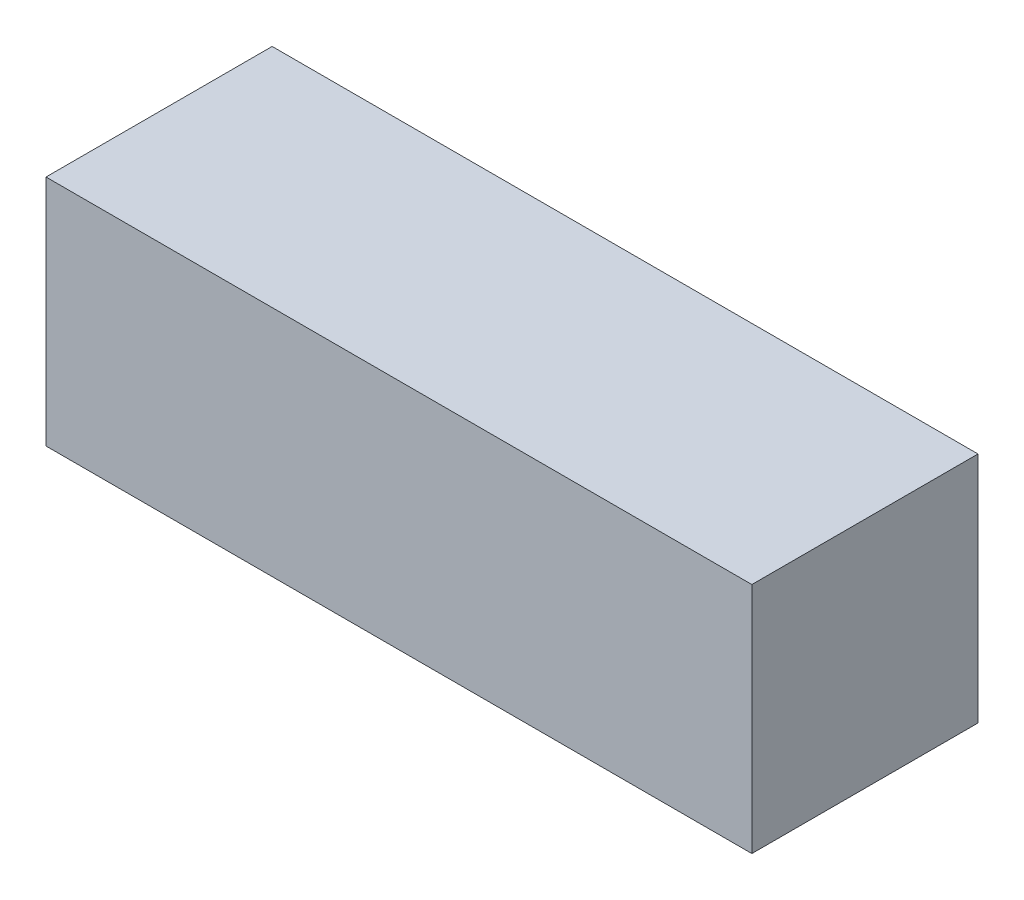
ISO-10303-21;
HEADER;
FILE_DESCRIPTION(('STEP AP214'),'2;1');
FILE_NAME('part.step','',(''),(''),'','','');
FILE_SCHEMA(('AUTOMOTIVE_DESIGN { 1 0 10303 214 1 1 1 1 }'));
ENDSEC;
DATA;
#1=APPLICATION_CONTEXT('core data for automotive mechanical design processes');
#2=APPLICATION_PROTOCOL_DEFINITION('international standard','automotive_design',2000,#1);
#3=PRODUCT_CONTEXT('',#1,'mechanical');
#4=PRODUCT('Part','Part','',(#3));
#5=PRODUCT_RELATED_PRODUCT_CATEGORY('part','',(#4));
#6=PRODUCT_DEFINITION_FORMATION('','',#4);
#7=PRODUCT_DEFINITION_CONTEXT('part definition',#1,'design');
#8=PRODUCT_DEFINITION('design','',#6,#7);
#9=PRODUCT_DEFINITION_SHAPE('','',#8);
#10=(LENGTH_UNIT() NAMED_UNIT(*) SI_UNIT(.MILLI.,.METRE.));
#11=(NAMED_UNIT(*) PLANE_ANGLE_UNIT() SI_UNIT($,.RADIAN.));
#12=(NAMED_UNIT(*) SI_UNIT($,.STERADIAN.) SOLID_ANGLE_UNIT());
#13=UNCERTAINTY_MEASURE_WITH_UNIT(LENGTH_MEASURE(1.E-05),#10,'distance_accuracy_value','');
#14=(GEOMETRIC_REPRESENTATION_CONTEXT(3) GLOBAL_UNCERTAINTY_ASSIGNED_CONTEXT((#13)) GLOBAL_UNIT_ASSIGNED_CONTEXT((#10,
#11,#12)) REPRESENTATION_CONTEXT('',''));
#15=CARTESIAN_POINT('',(0.,0.,0.));
#16=DIRECTION('',(0.,0.,1.));
#17=DIRECTION('',(1.,0.,0.));
#18=AXIS2_PLACEMENT_3D('',#15,#16,#17);
#19=CARTESIAN_POINT('',(0.,34.,0.));
#20=DIRECTION('',(1.,0.,0.));
#21=DIRECTION('',(0.,0.,-1.));
#22=AXIS2_PLACEMENT_3D('',#19,#20,#21);
#23=PLANE('',#22);
#24=DIRECTION('',(0.,0.,1.));
#25=VECTOR('',#24,1.);
#26=CARTESIAN_POINT('',(0.,0.,0.));
#27=LINE('',#26,#25);
#28=CARTESIAN_POINT('',(0.,0.,-33.));
#29=VERTEX_POINT('',#28);
#30=CARTESIAN_POINT('',(0.,0.,0.));
#31=VERTEX_POINT('',#30);
#32=EDGE_CURVE('E108',#29,#31,#27,.T.);
#33=ORIENTED_EDGE('',*,*,#32,.T.);
#34=DIRECTION('',(0.,-1.,0.));
#35=VECTOR('',#34,1.);
#36=CARTESIAN_POINT('',(0.,34.,0.));
#37=LINE('',#36,#35);
#38=CARTESIAN_POINT('',(0.,34.,0.));
#39=VERTEX_POINT('',#38);
#40=EDGE_CURVE('E11',#39,#31,#37,.T.);
#41=ORIENTED_EDGE('',*,*,#40,.F.);
#42=DIRECTION('',(0.,0.,1.));
#43=VECTOR('',#42,1.);
#44=CARTESIAN_POINT('',(0.,34.,0.));
#45=LINE('',#44,#43);
#46=CARTESIAN_POINT('',(0.,34.,-33.));
#47=VERTEX_POINT('',#46);
#48=EDGE_CURVE('E96',#47,#39,#45,.T.);
#49=ORIENTED_EDGE('',*,*,#48,.F.);
#50=DIRECTION('',(0.,-1.,0.));
#51=VECTOR('',#50,1.);
#52=CARTESIAN_POINT('',(0.,34.,-33.));
#53=LINE('',#52,#51);
#54=EDGE_CURVE('E104',#47,#29,#53,.T.);
#55=ORIENTED_EDGE('',*,*,#54,.T.);
#56=EDGE_LOOP('',(#33,#41,#49,#55));
#57=FACE_BOUND('',#56,.T.);
#58=ADVANCED_FACE('F45',(#57),#23,.F.);
#59=CARTESIAN_POINT('',(0.,34.,0.));
#60=DIRECTION('',(0.,0.,-1.));
#61=DIRECTION('',(-1.,0.,0.));
#62=AXIS2_PLACEMENT_3D('',#59,#60,#61);
#63=PLANE('',#62);
#64=DIRECTION('',(1.,0.,0.));
#65=VECTOR('',#64,1.);
#66=CARTESIAN_POINT('',(0.,0.,0.));
#67=LINE('',#66,#65);
#68=CARTESIAN_POINT('',(103.,0.,0.));
#69=VERTEX_POINT('',#68);
#70=EDGE_CURVE('E100',#31,#69,#67,.T.);
#71=ORIENTED_EDGE('',*,*,#70,.T.);
#72=DIRECTION('',(0.,-1.,0.));
#73=VECTOR('',#72,1.);
#74=CARTESIAN_POINT('',(103.,34.,0.));
#75=LINE('',#74,#73);
#76=CARTESIAN_POINT('',(103.,34.,0.));
#77=VERTEX_POINT('',#76);
#78=EDGE_CURVE('E53',#77,#69,#75,.T.);
#79=ORIENTED_EDGE('',*,*,#78,.F.);
#80=DIRECTION('',(1.,0.,0.));
#81=VECTOR('',#80,1.);
#82=CARTESIAN_POINT('',(0.,34.,0.));
#83=LINE('',#82,#81);
#84=EDGE_CURVE('E91',#39,#77,#83,.T.);
#85=ORIENTED_EDGE('',*,*,#84,.F.);
#86=ORIENTED_EDGE('',*,*,#40,.T.);
#87=EDGE_LOOP('',(#71,#79,#85,#86));
#88=FACE_BOUND('',#87,.T.);
#89=ADVANCED_FACE('F99',(#88),#63,.F.);
#90=CARTESIAN_POINT('',(103.,34.,0.));
#91=DIRECTION('',(-1.,0.,0.));
#92=DIRECTION('',(0.,0.,1.));
#93=AXIS2_PLACEMENT_3D('',#90,#91,#92);
#94=PLANE('',#93);
#95=DIRECTION('',(0.,0.,-1.));
#96=VECTOR('',#95,1.);
#97=CARTESIAN_POINT('',(103.,0.,0.));
#98=LINE('',#97,#96);
#99=CARTESIAN_POINT('',(103.,0.,-33.));
#100=VERTEX_POINT('',#99);
#101=EDGE_CURVE('E78',#69,#100,#98,.T.);
#102=ORIENTED_EDGE('',*,*,#101,.T.);
#103=DIRECTION('',(0.,-1.,0.));
#104=VECTOR('',#103,1.);
#105=CARTESIAN_POINT('',(103.,34.,-33.));
#106=LINE('',#105,#104);
#107=CARTESIAN_POINT('',(103.,34.,-33.));
#108=VERTEX_POINT('',#107);
#109=EDGE_CURVE('E101',#108,#100,#106,.T.);
#110=ORIENTED_EDGE('',*,*,#109,.F.);
#111=DIRECTION('',(0.,0.,-1.));
#112=VECTOR('',#111,1.);
#113=CARTESIAN_POINT('',(103.,34.,0.));
#114=LINE('',#113,#112);
#115=EDGE_CURVE('E94',#77,#108,#114,.T.);
#116=ORIENTED_EDGE('',*,*,#115,.F.);
#117=ORIENTED_EDGE('',*,*,#78,.T.);
#118=EDGE_LOOP('',(#102,#110,#116,#117));
#119=FACE_BOUND('',#118,.T.);
#120=ADVANCED_FACE('F102',(#119),#94,.F.);
#121=CARTESIAN_POINT('',(0.,34.,-33.));
#122=DIRECTION('',(0.,0.,1.));
#123=DIRECTION('',(1.,0.,0.));
#124=AXIS2_PLACEMENT_3D('',#121,#122,#123);
#125=PLANE('',#124);
#126=DIRECTION('',(-1.,0.,0.));
#127=VECTOR('',#126,1.);
#128=CARTESIAN_POINT('',(0.,0.,-33.));
#129=LINE('',#128,#127);
#130=EDGE_CURVE('E84',#100,#29,#129,.T.);
#131=ORIENTED_EDGE('',*,*,#130,.T.);
#132=ORIENTED_EDGE('',*,*,#54,.F.);
#133=DIRECTION('',(-1.,0.,0.));
#134=VECTOR('',#133,1.);
#135=CARTESIAN_POINT('',(0.,34.,-33.));
#136=LINE('',#135,#134);
#137=EDGE_CURVE('E61',#108,#47,#136,.T.);
#138=ORIENTED_EDGE('',*,*,#137,.F.);
#139=ORIENTED_EDGE('',*,*,#109,.T.);
#140=EDGE_LOOP('',(#131,#132,#138,#139));
#141=FACE_BOUND('',#140,.T.);
#142=ADVANCED_FACE('F115',(#141),#125,.F.);
#143=CARTESIAN_POINT('',(0.,34.,0.));
#144=DIRECTION('',(0.,-1.,0.));
#145=DIRECTION('',(0.,0.,-1.));
#146=AXIS2_PLACEMENT_3D('',#143,#144,#145);
#147=PLANE('',#146);
#148=ORIENTED_EDGE('',*,*,#48,.T.);
#149=ORIENTED_EDGE('',*,*,#84,.T.);
#150=ORIENTED_EDGE('',*,*,#115,.T.);
#151=ORIENTED_EDGE('',*,*,#137,.T.);
#152=EDGE_LOOP('',(#148,#149,#150,#151));
#153=FACE_BOUND('',#152,.T.);
#154=ADVANCED_FACE('F92',(#153),#147,.F.);
#155=CARTESIAN_POINT('',(0.,0.,0.));
#156=DIRECTION('',(0.,-1.,0.));
#157=DIRECTION('',(0.,0.,-1.));
#158=AXIS2_PLACEMENT_3D('',#155,#156,#157);
#159=PLANE('',#158);
#160=ORIENTED_EDGE('',*,*,#32,.F.);
#161=ORIENTED_EDGE('',*,*,#130,.F.);
#162=ORIENTED_EDGE('',*,*,#101,.F.);
#163=ORIENTED_EDGE('',*,*,#70,.F.);
#164=EDGE_LOOP('',(#160,#161,#162,#163));
#165=FACE_BOUND('',#164,.T.);
#166=ADVANCED_FACE('F118',(#165),#159,.T.);
#167=CLOSED_SHELL('',(#58,#89,#120,#142,#154,#166));
#168=MANIFOLD_SOLID_BREP('B2',#167);
#169=ADVANCED_BREP_SHAPE_REPRESENTATION('',(#18,#168),#14);
#170=SHAPE_DEFINITION_REPRESENTATION(#9,#169);
ENDSEC;
END-ISO-10303-21;
